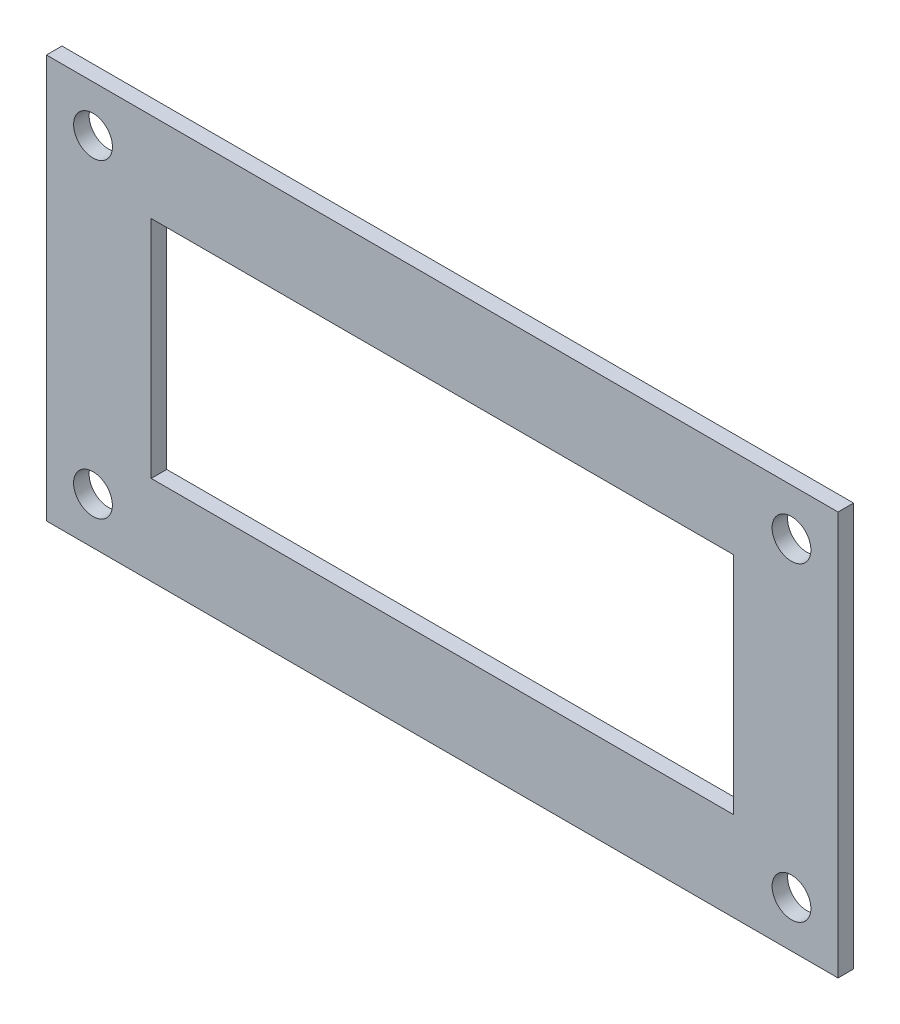
ISO-10303-21;
HEADER;
FILE_DESCRIPTION(('STEP AP214'),'2;1');
FILE_NAME('part.step','',(''),(''),'','','');
FILE_SCHEMA(('AUTOMOTIVE_DESIGN { 1 0 10303 214 1 1 1 1 }'));
ENDSEC;
DATA;
#1=APPLICATION_CONTEXT('core data for automotive mechanical design processes');
#2=APPLICATION_PROTOCOL_DEFINITION('international standard','automotive_design',2000,#1);
#3=PRODUCT_CONTEXT('',#1,'mechanical');
#4=PRODUCT('Part','Part','',(#3));
#5=PRODUCT_RELATED_PRODUCT_CATEGORY('part','',(#4));
#6=PRODUCT_DEFINITION_FORMATION('','',#4);
#7=PRODUCT_DEFINITION_CONTEXT('part definition',#1,'design');
#8=PRODUCT_DEFINITION('design','',#6,#7);
#9=PRODUCT_DEFINITION_SHAPE('','',#8);
#10=(LENGTH_UNIT() NAMED_UNIT(*) SI_UNIT(.MILLI.,.METRE.));
#11=(NAMED_UNIT(*) PLANE_ANGLE_UNIT() SI_UNIT($,.RADIAN.));
#12=(NAMED_UNIT(*) SI_UNIT($,.STERADIAN.) SOLID_ANGLE_UNIT());
#13=UNCERTAINTY_MEASURE_WITH_UNIT(LENGTH_MEASURE(1.E-05),#10,'distance_accuracy_value','');
#14=(GEOMETRIC_REPRESENTATION_CONTEXT(3) GLOBAL_UNCERTAINTY_ASSIGNED_CONTEXT((#13)) GLOBAL_UNIT_ASSIGNED_CONTEXT((#10,
#11,#12)) REPRESENTATION_CONTEXT('',''));
#15=CARTESIAN_POINT('',(0.,0.,0.));
#16=DIRECTION('',(0.,0.,1.));
#17=DIRECTION('',(1.,0.,0.));
#18=AXIS2_PLACEMENT_3D('',#15,#16,#17);
#19=CARTESIAN_POINT('',(0.,0.,2.));
#20=DIRECTION('',(0.,0.,-1.));
#21=DIRECTION('',(-1.,0.,0.));
#22=AXIS2_PLACEMENT_3D('',#19,#20,#21);
#23=PLANE('',#22);
#24=DIRECTION('',(0.,1.,0.));
#25=VECTOR('',#24,1.);
#26=CARTESIAN_POINT('',(51.,-26.,2.));
#27=LINE('',#26,#25);
#28=CARTESIAN_POINT('',(51.,-26.,2.));
#29=VERTEX_POINT('',#28);
#30=CARTESIAN_POINT('',(51.,26.,2.));
#31=VERTEX_POINT('',#30);
#32=EDGE_CURVE('E137',#29,#31,#27,.T.);
#33=ORIENTED_EDGE('',*,*,#32,.T.);
#34=DIRECTION('',(-1.,0.,0.));
#35=VECTOR('',#34,1.);
#36=CARTESIAN_POINT('',(-51.,26.,2.));
#37=LINE('',#36,#35);
#38=CARTESIAN_POINT('',(-51.,26.,2.));
#39=VERTEX_POINT('',#38);
#40=EDGE_CURVE('E140',#31,#39,#37,.T.);
#41=ORIENTED_EDGE('',*,*,#40,.T.);
#42=DIRECTION('',(0.,-1.,0.));
#43=VECTOR('',#42,1.);
#44=CARTESIAN_POINT('',(-51.,-26.,2.));
#45=LINE('',#44,#43);
#46=CARTESIAN_POINT('',(-51.,-26.,2.));
#47=VERTEX_POINT('',#46);
#48=EDGE_CURVE('E143',#39,#47,#45,.T.);
#49=ORIENTED_EDGE('',*,*,#48,.T.);
#50=DIRECTION('',(1.,0.,0.));
#51=VECTOR('',#50,1.);
#52=CARTESIAN_POINT('',(-51.,-26.,2.));
#53=LINE('',#52,#51);
#54=EDGE_CURVE('E145',#47,#29,#53,.T.);
#55=ORIENTED_EDGE('',*,*,#54,.T.);
#56=EDGE_LOOP('',(#33,#41,#49,#55));
#57=FACE_BOUND('',#56,.T.);
#58=DIRECTION('',(0.,1.,0.));
#59=VECTOR('',#58,1.);
#60=CARTESIAN_POINT('',(37.5,-14.5,2.));
#61=LINE('',#60,#59);
#62=CARTESIAN_POINT('',(37.5,-14.5,2.));
#63=VERTEX_POINT('',#62);
#64=CARTESIAN_POINT('',(37.5,14.5,2.));
#65=VERTEX_POINT('',#64);
#66=EDGE_CURVE('E98',#63,#65,#61,.T.);
#67=ORIENTED_EDGE('',*,*,#66,.F.);
#68=DIRECTION('',(1.,0.,0.));
#69=VECTOR('',#68,1.);
#70=CARTESIAN_POINT('',(-37.5,-14.5,2.));
#71=LINE('',#70,#69);
#72=CARTESIAN_POINT('',(-37.5,-14.5,2.));
#73=VERTEX_POINT('',#72);
#74=EDGE_CURVE('E121',#73,#63,#71,.T.);
#75=ORIENTED_EDGE('',*,*,#74,.F.);
#76=DIRECTION('',(0.,-1.,0.));
#77=VECTOR('',#76,1.);
#78=CARTESIAN_POINT('',(-37.5,-14.5,2.));
#79=LINE('',#78,#77);
#80=CARTESIAN_POINT('',(-37.5,14.5,2.));
#81=VERTEX_POINT('',#80);
#82=EDGE_CURVE('E119',#81,#73,#79,.T.);
#83=ORIENTED_EDGE('',*,*,#82,.F.);
#84=DIRECTION('',(-1.,0.,0.));
#85=VECTOR('',#84,1.);
#86=CARTESIAN_POINT('',(-37.5,14.5,2.));
#87=LINE('',#86,#85);
#88=EDGE_CURVE('E106',#65,#81,#87,.T.);
#89=ORIENTED_EDGE('',*,*,#88,.F.);
#90=EDGE_LOOP('',(#67,#75,#83,#89));
#91=FACE_BOUND('',#90,.T.);
#92=CARTESIAN_POINT('',(-45.,20.,2.));
#93=DIRECTION('',(0.,0.,1.));
#94=DIRECTION('',(1.,0.,0.));
#95=AXIS2_PLACEMENT_3D('',#92,#93,#94);
#96=CIRCLE('',#95,2.5);
#97=CARTESIAN_POINT('',(-42.5,20.,2.));
#98=VERTEX_POINT('',#97);
#99=EDGE_CURVE('E127',#98,#98,#96,.T.);
#100=ORIENTED_EDGE('',*,*,#99,.F.);
#101=EDGE_LOOP('',(#100));
#102=FACE_BOUND('',#101,.T.);
#103=CARTESIAN_POINT('',(45.,20.,2.));
#104=DIRECTION('',(0.,0.,1.));
#105=DIRECTION('',(-1.,0.,0.));
#106=AXIS2_PLACEMENT_3D('',#103,#104,#105);
#107=CIRCLE('',#106,2.5);
#108=CARTESIAN_POINT('',(42.5,20.,2.));
#109=VERTEX_POINT('',#108);
#110=EDGE_CURVE('E249',#109,#109,#107,.T.);
#111=ORIENTED_EDGE('',*,*,#110,.F.);
#112=EDGE_LOOP('',(#111));
#113=FACE_BOUND('',#112,.T.);
#114=CARTESIAN_POINT('',(45.,-20.,2.));
#115=DIRECTION('',(0.,0.,1.));
#116=DIRECTION('',(1.,0.,0.));
#117=AXIS2_PLACEMENT_3D('',#114,#115,#116);
#118=CIRCLE('',#117,2.5);
#119=CARTESIAN_POINT('',(47.5,-20.,2.));
#120=VERTEX_POINT('',#119);
#121=EDGE_CURVE('E243',#120,#120,#118,.T.);
#122=ORIENTED_EDGE('',*,*,#121,.F.);
#123=EDGE_LOOP('',(#122));
#124=FACE_BOUND('',#123,.T.);
#125=CARTESIAN_POINT('',(-45.,-20.,2.));
#126=DIRECTION('',(0.,0.,1.));
#127=DIRECTION('',(-1.,0.,0.));
#128=AXIS2_PLACEMENT_3D('',#125,#126,#127);
#129=CIRCLE('',#128,2.5);
#130=CARTESIAN_POINT('',(-47.5,-20.,2.));
#131=VERTEX_POINT('',#130);
#132=EDGE_CURVE('E234',#131,#131,#129,.T.);
#133=ORIENTED_EDGE('',*,*,#132,.F.);
#134=EDGE_LOOP('',(#133));
#135=FACE_BOUND('',#134,.T.);
#136=ADVANCED_FACE('F33',(#57,#91,#102,#113,#124,#135),#23,.F.);
#137=CARTESIAN_POINT('',(0.,0.,0.));
#138=DIRECTION('',(0.,0.,-1.));
#139=DIRECTION('',(-1.,0.,0.));
#140=AXIS2_PLACEMENT_3D('',#137,#138,#139);
#141=PLANE('',#140);
#142=CARTESIAN_POINT('',(45.,-20.,0.));
#143=DIRECTION('',(0.,0.,1.));
#144=DIRECTION('',(1.,0.,0.));
#145=AXIS2_PLACEMENT_3D('',#142,#143,#144);
#146=CIRCLE('',#145,2.5);
#147=CARTESIAN_POINT('',(47.5,-20.,0.));
#148=VERTEX_POINT('',#147);
#149=EDGE_CURVE('E240',#148,#148,#146,.T.);
#150=ORIENTED_EDGE('',*,*,#149,.T.);
#151=EDGE_LOOP('',(#150));
#152=FACE_BOUND('',#151,.T.);
#153=CARTESIAN_POINT('',(-45.,20.,0.));
#154=DIRECTION('',(0.,0.,1.));
#155=DIRECTION('',(1.,0.,0.));
#156=AXIS2_PLACEMENT_3D('',#153,#154,#155);
#157=CIRCLE('',#156,2.5);
#158=CARTESIAN_POINT('',(-42.5,20.,0.));
#159=VERTEX_POINT('',#158);
#160=EDGE_CURVE('E252',#159,#159,#157,.T.);
#161=ORIENTED_EDGE('',*,*,#160,.T.);
#162=EDGE_LOOP('',(#161));
#163=FACE_BOUND('',#162,.T.);
#164=DIRECTION('',(0.,1.,0.));
#165=VECTOR('',#164,1.);
#166=CARTESIAN_POINT('',(51.,-26.,0.));
#167=LINE('',#166,#165);
#168=CARTESIAN_POINT('',(51.,-26.,0.));
#169=VERTEX_POINT('',#168);
#170=CARTESIAN_POINT('',(51.,26.,0.));
#171=VERTEX_POINT('',#170);
#172=EDGE_CURVE('E114',#169,#171,#167,.T.);
#173=ORIENTED_EDGE('',*,*,#172,.F.);
#174=DIRECTION('',(1.,0.,0.));
#175=VECTOR('',#174,1.);
#176=CARTESIAN_POINT('',(-51.,-26.,0.));
#177=LINE('',#176,#175);
#178=CARTESIAN_POINT('',(-51.,-26.,0.));
#179=VERTEX_POINT('',#178);
#180=EDGE_CURVE('E141',#179,#169,#177,.T.);
#181=ORIENTED_EDGE('',*,*,#180,.F.);
#182=DIRECTION('',(0.,-1.,0.));
#183=VECTOR('',#182,1.);
#184=CARTESIAN_POINT('',(-51.,-26.,0.));
#185=LINE('',#184,#183);
#186=CARTESIAN_POINT('',(-51.,26.,0.));
#187=VERTEX_POINT('',#186);
#188=EDGE_CURVE('E152',#187,#179,#185,.T.);
#189=ORIENTED_EDGE('',*,*,#188,.F.);
#190=DIRECTION('',(-1.,0.,0.));
#191=VECTOR('',#190,1.);
#192=CARTESIAN_POINT('',(-51.,26.,0.));
#193=LINE('',#192,#191);
#194=EDGE_CURVE('E150',#171,#187,#193,.T.);
#195=ORIENTED_EDGE('',*,*,#194,.F.);
#196=EDGE_LOOP('',(#173,#181,#189,#195));
#197=FACE_BOUND('',#196,.T.);
#198=DIRECTION('',(1.,0.,0.));
#199=VECTOR('',#198,1.);
#200=CARTESIAN_POINT('',(-37.5,-14.5,0.));
#201=LINE('',#200,#199);
#202=CARTESIAN_POINT('',(-37.5,-14.5,0.));
#203=VERTEX_POINT('',#202);
#204=CARTESIAN_POINT('',(37.5,-14.5,0.));
#205=VERTEX_POINT('',#204);
#206=EDGE_CURVE('E107',#203,#205,#201,.T.);
#207=ORIENTED_EDGE('',*,*,#206,.T.);
#208=DIRECTION('',(0.,1.,0.));
#209=VECTOR('',#208,1.);
#210=CARTESIAN_POINT('',(37.5,-14.5,0.));
#211=LINE('',#210,#209);
#212=CARTESIAN_POINT('',(37.5,14.5,0.));
#213=VERTEX_POINT('',#212);
#214=EDGE_CURVE('E56',#205,#213,#211,.T.);
#215=ORIENTED_EDGE('',*,*,#214,.T.);
#216=DIRECTION('',(-1.,0.,0.));
#217=VECTOR('',#216,1.);
#218=CARTESIAN_POINT('',(-37.5,14.5,0.));
#219=LINE('',#218,#217);
#220=CARTESIAN_POINT('',(-37.5,14.5,0.));
#221=VERTEX_POINT('',#220);
#222=EDGE_CURVE('E113',#213,#221,#219,.T.);
#223=ORIENTED_EDGE('',*,*,#222,.T.);
#224=DIRECTION('',(0.,-1.,0.));
#225=VECTOR('',#224,1.);
#226=CARTESIAN_POINT('',(-37.5,-14.5,0.));
#227=LINE('',#226,#225);
#228=EDGE_CURVE('E129',#221,#203,#227,.T.);
#229=ORIENTED_EDGE('',*,*,#228,.T.);
#230=EDGE_LOOP('',(#207,#215,#223,#229));
#231=FACE_BOUND('',#230,.T.);
#232=CARTESIAN_POINT('',(45.,20.,0.));
#233=DIRECTION('',(0.,0.,1.));
#234=DIRECTION('',(-1.,0.,0.));
#235=AXIS2_PLACEMENT_3D('',#232,#233,#234);
#236=CIRCLE('',#235,2.5);
#237=CARTESIAN_POINT('',(42.5,20.,0.));
#238=VERTEX_POINT('',#237);
#239=EDGE_CURVE('E246',#238,#238,#236,.T.);
#240=ORIENTED_EDGE('',*,*,#239,.T.);
#241=EDGE_LOOP('',(#240));
#242=FACE_BOUND('',#241,.T.);
#243=CARTESIAN_POINT('',(-45.,-20.,0.));
#244=DIRECTION('',(0.,0.,1.));
#245=DIRECTION('',(-1.,0.,0.));
#246=AXIS2_PLACEMENT_3D('',#243,#244,#245);
#247=CIRCLE('',#246,2.5);
#248=CARTESIAN_POINT('',(-47.5,-20.,0.));
#249=VERTEX_POINT('',#248);
#250=EDGE_CURVE('E237',#249,#249,#247,.T.);
#251=ORIENTED_EDGE('',*,*,#250,.T.);
#252=EDGE_LOOP('',(#251));
#253=FACE_BOUND('',#252,.T.);
#254=ADVANCED_FACE('F170',(#152,#163,#197,#231,#242,#253),#141,.T.);
#255=CARTESIAN_POINT('',(51.,-26.,2.));
#256=DIRECTION('',(-1.,0.,0.));
#257=DIRECTION('',(0.,0.,1.));
#258=AXIS2_PLACEMENT_3D('',#255,#256,#257);
#259=PLANE('',#258);
#260=ORIENTED_EDGE('',*,*,#172,.T.);
#261=DIRECTION('',(0.,0.,-1.));
#262=VECTOR('',#261,1.);
#263=CARTESIAN_POINT('',(51.,26.,2.));
#264=LINE('',#263,#262);
#265=EDGE_CURVE('E11',#31,#171,#264,.T.);
#266=ORIENTED_EDGE('',*,*,#265,.F.);
#267=ORIENTED_EDGE('',*,*,#32,.F.);
#268=DIRECTION('',(0.,0.,-1.));
#269=VECTOR('',#268,1.);
#270=CARTESIAN_POINT('',(51.,-26.,2.));
#271=LINE('',#270,#269);
#272=EDGE_CURVE('E147',#29,#169,#271,.T.);
#273=ORIENTED_EDGE('',*,*,#272,.T.);
#274=EDGE_LOOP('',(#260,#266,#267,#273));
#275=FACE_BOUND('',#274,.T.);
#276=ADVANCED_FACE('F35',(#275),#259,.F.);
#277=CARTESIAN_POINT('',(-51.,26.,2.));
#278=DIRECTION('',(0.,-1.,0.));
#279=DIRECTION('',(0.,0.,-1.));
#280=AXIS2_PLACEMENT_3D('',#277,#278,#279);
#281=PLANE('',#280);
#282=ORIENTED_EDGE('',*,*,#194,.T.);
#283=DIRECTION('',(0.,0.,-1.));
#284=VECTOR('',#283,1.);
#285=CARTESIAN_POINT('',(-51.,26.,2.));
#286=LINE('',#285,#284);
#287=EDGE_CURVE('E41',#39,#187,#286,.T.);
#288=ORIENTED_EDGE('',*,*,#287,.F.);
#289=ORIENTED_EDGE('',*,*,#40,.F.);
#290=ORIENTED_EDGE('',*,*,#265,.T.);
#291=EDGE_LOOP('',(#282,#288,#289,#290));
#292=FACE_BOUND('',#291,.T.);
#293=ADVANCED_FACE('F180',(#292),#281,.F.);
#294=CARTESIAN_POINT('',(-51.,-26.,2.));
#295=DIRECTION('',(1.,0.,0.));
#296=DIRECTION('',(0.,0.,-1.));
#297=AXIS2_PLACEMENT_3D('',#294,#295,#296);
#298=PLANE('',#297);
#299=ORIENTED_EDGE('',*,*,#188,.T.);
#300=DIRECTION('',(0.,0.,-1.));
#301=VECTOR('',#300,1.);
#302=CARTESIAN_POINT('',(-51.,-26.,2.));
#303=LINE('',#302,#301);
#304=EDGE_CURVE('E157',#47,#179,#303,.T.);
#305=ORIENTED_EDGE('',*,*,#304,.F.);
#306=ORIENTED_EDGE('',*,*,#48,.F.);
#307=ORIENTED_EDGE('',*,*,#287,.T.);
#308=EDGE_LOOP('',(#299,#305,#306,#307));
#309=FACE_BOUND('',#308,.T.);
#310=ADVANCED_FACE('F164',(#309),#298,.F.);
#311=CARTESIAN_POINT('',(-51.,-26.,2.));
#312=DIRECTION('',(0.,1.,0.));
#313=DIRECTION('',(0.,0.,1.));
#314=AXIS2_PLACEMENT_3D('',#311,#312,#313);
#315=PLANE('',#314);
#316=ORIENTED_EDGE('',*,*,#180,.T.);
#317=ORIENTED_EDGE('',*,*,#272,.F.);
#318=ORIENTED_EDGE('',*,*,#54,.F.);
#319=ORIENTED_EDGE('',*,*,#304,.T.);
#320=EDGE_LOOP('',(#316,#317,#318,#319));
#321=FACE_BOUND('',#320,.T.);
#322=ADVANCED_FACE('F174',(#321),#315,.F.);
#323=CARTESIAN_POINT('',(37.5,-14.5,2.));
#324=DIRECTION('',(-1.,0.,0.));
#325=DIRECTION('',(0.,0.,1.));
#326=AXIS2_PLACEMENT_3D('',#323,#324,#325);
#327=PLANE('',#326);
#328=ORIENTED_EDGE('',*,*,#214,.F.);
#329=DIRECTION('',(0.,0.,-1.));
#330=VECTOR('',#329,1.);
#331=CARTESIAN_POINT('',(37.5,-14.5,2.));
#332=LINE('',#331,#330);
#333=EDGE_CURVE('E102',#63,#205,#332,.T.);
#334=ORIENTED_EDGE('',*,*,#333,.F.);
#335=ORIENTED_EDGE('',*,*,#66,.T.);
#336=DIRECTION('',(0.,0.,-1.));
#337=VECTOR('',#336,1.);
#338=CARTESIAN_POINT('',(37.5,14.5,2.));
#339=LINE('',#338,#337);
#340=EDGE_CURVE('E101',#65,#213,#339,.T.);
#341=ORIENTED_EDGE('',*,*,#340,.T.);
#342=EDGE_LOOP('',(#328,#334,#335,#341));
#343=FACE_BOUND('',#342,.T.);
#344=ADVANCED_FACE('F100',(#343),#327,.T.);
#345=CARTESIAN_POINT('',(-37.5,14.5,2.));
#346=DIRECTION('',(0.,-1.,0.));
#347=DIRECTION('',(0.,0.,-1.));
#348=AXIS2_PLACEMENT_3D('',#345,#346,#347);
#349=PLANE('',#348);
#350=ORIENTED_EDGE('',*,*,#222,.F.);
#351=ORIENTED_EDGE('',*,*,#340,.F.);
#352=ORIENTED_EDGE('',*,*,#88,.T.);
#353=DIRECTION('',(0.,0.,-1.));
#354=VECTOR('',#353,1.);
#355=CARTESIAN_POINT('',(-37.5,14.5,2.));
#356=LINE('',#355,#354);
#357=EDGE_CURVE('E115',#81,#221,#356,.T.);
#358=ORIENTED_EDGE('',*,*,#357,.T.);
#359=EDGE_LOOP('',(#350,#351,#352,#358));
#360=FACE_BOUND('',#359,.T.);
#361=ADVANCED_FACE('F110',(#360),#349,.T.);
#362=CARTESIAN_POINT('',(-37.5,-14.5,2.));
#363=DIRECTION('',(1.,0.,0.));
#364=DIRECTION('',(0.,0.,-1.));
#365=AXIS2_PLACEMENT_3D('',#362,#363,#364);
#366=PLANE('',#365);
#367=ORIENTED_EDGE('',*,*,#228,.F.);
#368=ORIENTED_EDGE('',*,*,#357,.F.);
#369=ORIENTED_EDGE('',*,*,#82,.T.);
#370=DIRECTION('',(0.,0.,-1.));
#371=VECTOR('',#370,1.);
#372=CARTESIAN_POINT('',(-37.5,-14.5,2.));
#373=LINE('',#372,#371);
#374=EDGE_CURVE('E48',#73,#203,#373,.T.);
#375=ORIENTED_EDGE('',*,*,#374,.T.);
#376=EDGE_LOOP('',(#367,#368,#369,#375));
#377=FACE_BOUND('',#376,.T.);
#378=ADVANCED_FACE('F204',(#377),#366,.T.);
#379=CARTESIAN_POINT('',(-37.5,-14.5,2.));
#380=DIRECTION('',(0.,1.,0.));
#381=DIRECTION('',(0.,0.,1.));
#382=AXIS2_PLACEMENT_3D('',#379,#380,#381);
#383=PLANE('',#382);
#384=ORIENTED_EDGE('',*,*,#206,.F.);
#385=ORIENTED_EDGE('',*,*,#374,.F.);
#386=ORIENTED_EDGE('',*,*,#74,.T.);
#387=ORIENTED_EDGE('',*,*,#333,.T.);
#388=EDGE_LOOP('',(#384,#385,#386,#387));
#389=FACE_BOUND('',#388,.T.);
#390=ADVANCED_FACE('F208',(#389),#383,.T.);
#391=CARTESIAN_POINT('',(-45.,20.,2.));
#392=DIRECTION('',(0.,0.,-1.));
#393=DIRECTION('',(-1.,0.,0.));
#394=AXIS2_PLACEMENT_3D('',#391,#392,#393);
#395=CYLINDRICAL_SURFACE('',#394,2.5);
#396=ORIENTED_EDGE('',*,*,#99,.T.);
#397=EDGE_LOOP('',(#396));
#398=FACE_BOUND('',#397,.T.);
#399=ORIENTED_EDGE('',*,*,#160,.F.);
#400=EDGE_LOOP('',(#399));
#401=FACE_BOUND('',#400,.T.);
#402=ADVANCED_FACE('F214',(#398,#401),#395,.F.);
#403=CARTESIAN_POINT('',(45.,20.,2.));
#404=DIRECTION('',(0.,0.,-1.));
#405=DIRECTION('',(-1.,0.,0.));
#406=AXIS2_PLACEMENT_3D('',#403,#404,#405);
#407=CYLINDRICAL_SURFACE('',#406,2.5);
#408=ORIENTED_EDGE('',*,*,#110,.T.);
#409=EDGE_LOOP('',(#408));
#410=FACE_BOUND('',#409,.T.);
#411=ORIENTED_EDGE('',*,*,#239,.F.);
#412=EDGE_LOOP('',(#411));
#413=FACE_BOUND('',#412,.T.);
#414=ADVANCED_FACE('F217',(#410,#413),#407,.F.);
#415=CARTESIAN_POINT('',(45.,-20.,2.));
#416=DIRECTION('',(0.,0.,-1.));
#417=DIRECTION('',(-1.,0.,0.));
#418=AXIS2_PLACEMENT_3D('',#415,#416,#417);
#419=CYLINDRICAL_SURFACE('',#418,2.5);
#420=ORIENTED_EDGE('',*,*,#121,.T.);
#421=EDGE_LOOP('',(#420));
#422=FACE_BOUND('',#421,.T.);
#423=ORIENTED_EDGE('',*,*,#149,.F.);
#424=EDGE_LOOP('',(#423));
#425=FACE_BOUND('',#424,.T.);
#426=ADVANCED_FACE('F221',(#422,#425),#419,.F.);
#427=CARTESIAN_POINT('',(-45.,-20.,2.));
#428=DIRECTION('',(0.,0.,-1.));
#429=DIRECTION('',(-1.,0.,0.));
#430=AXIS2_PLACEMENT_3D('',#427,#428,#429);
#431=CYLINDRICAL_SURFACE('',#430,2.5);
#432=ORIENTED_EDGE('',*,*,#132,.T.);
#433=EDGE_LOOP('',(#432));
#434=FACE_BOUND('',#433,.T.);
#435=ORIENTED_EDGE('',*,*,#250,.F.);
#436=EDGE_LOOP('',(#435));
#437=FACE_BOUND('',#436,.T.);
#438=ADVANCED_FACE('F225',(#434,#437),#431,.F.);
#439=CLOSED_SHELL('',(#136,#254,#276,#293,#310,#322,#344,#361,#378,#390,#402,#414,#426,#438));
#440=MANIFOLD_SOLID_BREP('B2',#439);
#441=ADVANCED_BREP_SHAPE_REPRESENTATION('',(#18,#440),#14);
#442=SHAPE_DEFINITION_REPRESENTATION(#9,#441);
ENDSEC;
END-ISO-10303-21;
